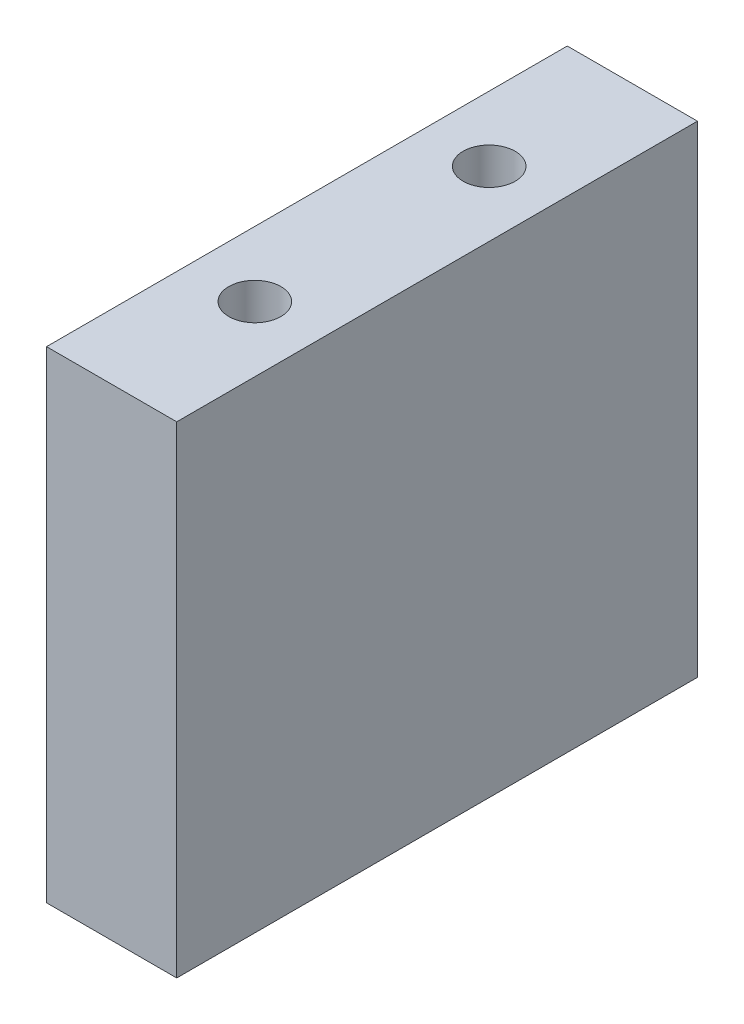
ISO-10303-21;
HEADER;
FILE_DESCRIPTION(('STEP AP214'),'2;1');
FILE_NAME('part.step','',(''),(''),'','','');
FILE_SCHEMA(('AUTOMOTIVE_DESIGN { 1 0 10303 214 1 1 1 1 }'));
ENDSEC;
DATA;
#1=APPLICATION_CONTEXT('core data for automotive mechanical design processes');
#2=APPLICATION_PROTOCOL_DEFINITION('international standard','automotive_design',2000,#1);
#3=PRODUCT_CONTEXT('',#1,'mechanical');
#4=PRODUCT('Part','Part','',(#3));
#5=PRODUCT_RELATED_PRODUCT_CATEGORY('part','',(#4));
#6=PRODUCT_DEFINITION_FORMATION('','',#4);
#7=PRODUCT_DEFINITION_CONTEXT('part definition',#1,'design');
#8=PRODUCT_DEFINITION('design','',#6,#7);
#9=PRODUCT_DEFINITION_SHAPE('','',#8);
#10=(LENGTH_UNIT() NAMED_UNIT(*) SI_UNIT(.MILLI.,.METRE.));
#11=(NAMED_UNIT(*) PLANE_ANGLE_UNIT() SI_UNIT($,.RADIAN.));
#12=(NAMED_UNIT(*) SI_UNIT($,.STERADIAN.) SOLID_ANGLE_UNIT());
#13=UNCERTAINTY_MEASURE_WITH_UNIT(LENGTH_MEASURE(1.E-05),#10,'distance_accuracy_value','');
#14=(GEOMETRIC_REPRESENTATION_CONTEXT(3) GLOBAL_UNCERTAINTY_ASSIGNED_CONTEXT((#13)) GLOBAL_UNIT_ASSIGNED_CONTEXT((#10,
#11,#12)) REPRESENTATION_CONTEXT('',''));
#15=CARTESIAN_POINT('',(0.,0.,0.));
#16=DIRECTION('',(0.,0.,1.));
#17=DIRECTION('',(1.,0.,0.));
#18=AXIS2_PLACEMENT_3D('',#15,#16,#17);
#19=CARTESIAN_POINT('',(-20.,37.,-40.));
#20=DIRECTION('',(0.,0.,-1.));
#21=DIRECTION('',(0.,1.,0.));
#22=AXIS2_PLACEMENT_3D('',#19,#20,#21);
#23=PLANE('',#22);
#24=DIRECTION('',(0.,1.,0.));
#25=VECTOR('',#24,1.);
#26=CARTESIAN_POINT('',(0.,37.,-40.));
#27=LINE('',#26,#25);
#28=CARTESIAN_POINT('',(0.,-37.,-40.));
#29=VERTEX_POINT('',#28);
#30=CARTESIAN_POINT('',(0.,37.,-40.));
#31=VERTEX_POINT('',#30);
#32=EDGE_CURVE('E98',#29,#31,#27,.T.);
#33=ORIENTED_EDGE('',*,*,#32,.F.);
#34=DIRECTION('',(1.,0.,0.));
#35=VECTOR('',#34,1.);
#36=CARTESIAN_POINT('',(-20.,-37.,-40.));
#37=LINE('',#36,#35);
#38=CARTESIAN_POINT('',(-20.,-37.,-40.));
#39=VERTEX_POINT('',#38);
#40=EDGE_CURVE('E11',#39,#29,#37,.T.);
#41=ORIENTED_EDGE('',*,*,#40,.F.);
#42=DIRECTION('',(0.,1.,0.));
#43=VECTOR('',#42,1.);
#44=CARTESIAN_POINT('',(-20.,37.,-40.));
#45=LINE('',#44,#43);
#46=CARTESIAN_POINT('',(-20.,37.,-40.));
#47=VERTEX_POINT('',#46);
#48=EDGE_CURVE('E91',#39,#47,#45,.T.);
#49=ORIENTED_EDGE('',*,*,#48,.T.);
#50=DIRECTION('',(1.,0.,0.));
#51=VECTOR('',#50,1.);
#52=CARTESIAN_POINT('',(-20.,37.,-40.));
#53=LINE('',#52,#51);
#54=EDGE_CURVE('E36',#47,#31,#53,.T.);
#55=ORIENTED_EDGE('',*,*,#54,.T.);
#56=EDGE_LOOP('',(#33,#41,#49,#55));
#57=FACE_BOUND('',#56,.T.);
#58=ADVANCED_FACE('F33',(#57),#23,.T.);
#59=CARTESIAN_POINT('',(-20.,-37.,40.));
#60=DIRECTION('',(0.,-1.,0.));
#61=DIRECTION('',(0.,0.,-1.));
#62=AXIS2_PLACEMENT_3D('',#59,#60,#61);
#63=PLANE('',#62);
#64=CARTESIAN_POINT('',(-10.,-37.,-30.));
#65=DIRECTION('',(0.,-1.,0.));
#66=DIRECTION('',(0.,0.,-1.));
#67=AXIS2_PLACEMENT_3D('',#64,#65,#66);
#68=CIRCLE('',#67,4.);
#69=CARTESIAN_POINT('',(-10.,-37.,-34.));
#70=VERTEX_POINT('',#69);
#71=EDGE_CURVE('E149',#70,#70,#68,.T.);
#72=ORIENTED_EDGE('',*,*,#71,.F.);
#73=EDGE_LOOP('',(#72));
#74=FACE_BOUND('',#73,.T.);
#75=CARTESIAN_POINT('',(-10.,-37.,30.));
#76=DIRECTION('',(0.,-1.,0.));
#77=DIRECTION('',(0.,0.,-1.));
#78=AXIS2_PLACEMENT_3D('',#75,#76,#77);
#79=CIRCLE('',#78,4.);
#80=CARTESIAN_POINT('',(-10.,-37.,26.));
#81=VERTEX_POINT('',#80);
#82=EDGE_CURVE('E143',#81,#81,#79,.T.);
#83=ORIENTED_EDGE('',*,*,#82,.F.);
#84=EDGE_LOOP('',(#83));
#85=FACE_BOUND('',#84,.T.);
#86=DIRECTION('',(0.,0.,-1.));
#87=VECTOR('',#86,1.);
#88=CARTESIAN_POINT('',(0.,-37.,40.));
#89=LINE('',#88,#87);
#90=CARTESIAN_POINT('',(0.,-37.,40.));
#91=VERTEX_POINT('',#90);
#92=EDGE_CURVE('E93',#91,#29,#89,.T.);
#93=ORIENTED_EDGE('',*,*,#92,.F.);
#94=DIRECTION('',(1.,0.,0.));
#95=VECTOR('',#94,1.);
#96=CARTESIAN_POINT('',(-20.,-37.,40.));
#97=LINE('',#96,#95);
#98=CARTESIAN_POINT('',(-20.,-37.,40.));
#99=VERTEX_POINT('',#98);
#100=EDGE_CURVE('E42',#99,#91,#97,.T.);
#101=ORIENTED_EDGE('',*,*,#100,.F.);
#102=DIRECTION('',(0.,0.,-1.));
#103=VECTOR('',#102,1.);
#104=CARTESIAN_POINT('',(-20.,-37.,40.));
#105=LINE('',#104,#103);
#106=EDGE_CURVE('E88',#99,#39,#105,.T.);
#107=ORIENTED_EDGE('',*,*,#106,.T.);
#108=ORIENTED_EDGE('',*,*,#40,.T.);
#109=EDGE_LOOP('',(#93,#101,#107,#108));
#110=FACE_BOUND('',#109,.T.);
#111=ADVANCED_FACE('F109',(#74,#85,#110),#63,.T.);
#112=CARTESIAN_POINT('',(-20.,37.,40.));
#113=DIRECTION('',(0.,0.,1.));
#114=DIRECTION('',(0.,-1.,0.));
#115=AXIS2_PLACEMENT_3D('',#112,#113,#114);
#116=PLANE('',#115);
#117=DIRECTION('',(0.,-1.,0.));
#118=VECTOR('',#117,1.);
#119=CARTESIAN_POINT('',(0.,37.,40.));
#120=LINE('',#119,#118);
#121=CARTESIAN_POINT('',(0.,37.,40.));
#122=VERTEX_POINT('',#121);
#123=EDGE_CURVE('E83',#122,#91,#120,.T.);
#124=ORIENTED_EDGE('',*,*,#123,.F.);
#125=DIRECTION('',(1.,0.,0.));
#126=VECTOR('',#125,1.);
#127=CARTESIAN_POINT('',(-20.,37.,40.));
#128=LINE('',#127,#126);
#129=CARTESIAN_POINT('',(-20.,37.,40.));
#130=VERTEX_POINT('',#129);
#131=EDGE_CURVE('E78',#130,#122,#128,.T.);
#132=ORIENTED_EDGE('',*,*,#131,.F.);
#133=DIRECTION('',(0.,-1.,0.));
#134=VECTOR('',#133,1.);
#135=CARTESIAN_POINT('',(-20.,37.,40.));
#136=LINE('',#135,#134);
#137=EDGE_CURVE('E81',#130,#99,#136,.T.);
#138=ORIENTED_EDGE('',*,*,#137,.T.);
#139=ORIENTED_EDGE('',*,*,#100,.T.);
#140=EDGE_LOOP('',(#124,#132,#138,#139));
#141=FACE_BOUND('',#140,.T.);
#142=ADVANCED_FACE('F80',(#141),#116,.T.);
#143=CARTESIAN_POINT('',(-20.,37.,40.));
#144=DIRECTION('',(0.,1.,0.));
#145=DIRECTION('',(0.,0.,1.));
#146=AXIS2_PLACEMENT_3D('',#143,#144,#145);
#147=PLANE('',#146);
#148=CARTESIAN_POINT('',(-10.,37.,-18.));
#149=DIRECTION('',(0.,1.,0.));
#150=DIRECTION('',(0.,0.,1.));
#151=AXIS2_PLACEMENT_3D('',#148,#149,#150);
#152=CIRCLE('',#151,4.);
#153=CARTESIAN_POINT('',(-10.,37.,-14.));
#154=VERTEX_POINT('',#153);
#155=EDGE_CURVE('E130',#154,#154,#152,.T.);
#156=ORIENTED_EDGE('',*,*,#155,.F.);
#157=EDGE_LOOP('',(#156));
#158=FACE_BOUND('',#157,.T.);
#159=CARTESIAN_POINT('',(-10.,37.,18.));
#160=DIRECTION('',(0.,1.,0.));
#161=DIRECTION('',(0.,0.,1.));
#162=AXIS2_PLACEMENT_3D('',#159,#160,#161);
#163=CIRCLE('',#162,4.);
#164=CARTESIAN_POINT('',(-10.,37.,22.));
#165=VERTEX_POINT('',#164);
#166=EDGE_CURVE('E133',#165,#165,#163,.T.);
#167=ORIENTED_EDGE('',*,*,#166,.F.);
#168=EDGE_LOOP('',(#167));
#169=FACE_BOUND('',#168,.T.);
#170=DIRECTION('',(0.,0.,1.));
#171=VECTOR('',#170,1.);
#172=CARTESIAN_POINT('',(0.,37.,40.));
#173=LINE('',#172,#171);
#174=EDGE_CURVE('E101',#31,#122,#173,.T.);
#175=ORIENTED_EDGE('',*,*,#174,.F.);
#176=ORIENTED_EDGE('',*,*,#54,.F.);
#177=DIRECTION('',(0.,0.,1.));
#178=VECTOR('',#177,1.);
#179=CARTESIAN_POINT('',(-20.,37.,40.));
#180=LINE('',#179,#178);
#181=EDGE_CURVE('E87',#47,#130,#180,.T.);
#182=ORIENTED_EDGE('',*,*,#181,.T.);
#183=ORIENTED_EDGE('',*,*,#131,.T.);
#184=EDGE_LOOP('',(#175,#176,#182,#183));
#185=FACE_BOUND('',#184,.T.);
#186=ADVANCED_FACE('F90',(#158,#169,#185),#147,.T.);
#187=CARTESIAN_POINT('',(-20.,0.,0.));
#188=DIRECTION('',(1.,0.,0.));
#189=DIRECTION('',(0.,0.,-1.));
#190=AXIS2_PLACEMENT_3D('',#187,#188,#189);
#191=PLANE('',#190);
#192=ORIENTED_EDGE('',*,*,#48,.F.);
#193=ORIENTED_EDGE('',*,*,#106,.F.);
#194=ORIENTED_EDGE('',*,*,#137,.F.);
#195=ORIENTED_EDGE('',*,*,#181,.F.);
#196=EDGE_LOOP('',(#192,#193,#194,#195));
#197=FACE_BOUND('',#196,.T.);
#198=ADVANCED_FACE('F86',(#197),#191,.F.);
#199=CARTESIAN_POINT('',(0.,0.,0.));
#200=DIRECTION('',(1.,0.,0.));
#201=DIRECTION('',(0.,0.,-1.));
#202=AXIS2_PLACEMENT_3D('',#199,#200,#201);
#203=PLANE('',#202);
#204=ORIENTED_EDGE('',*,*,#32,.T.);
#205=ORIENTED_EDGE('',*,*,#174,.T.);
#206=ORIENTED_EDGE('',*,*,#123,.T.);
#207=ORIENTED_EDGE('',*,*,#92,.T.);
#208=EDGE_LOOP('',(#204,#205,#206,#207));
#209=FACE_BOUND('',#208,.T.);
#210=ADVANCED_FACE('F108',(#209),#203,.T.);
#211=CARTESIAN_POINT('',(-10.,12.,18.));
#212=DIRECTION('',(0.,1.,0.));
#213=DIRECTION('',(0.,0.,1.));
#214=AXIS2_PLACEMENT_3D('',#211,#212,#213);
#215=CYLINDRICAL_SURFACE('',#214,4.);
#216=CARTESIAN_POINT('',(-10.,12.,18.));
#217=DIRECTION('',(0.,1.,0.));
#218=DIRECTION('',(0.,0.,1.));
#219=AXIS2_PLACEMENT_3D('',#216,#217,#218);
#220=CIRCLE('',#219,4.);
#221=CARTESIAN_POINT('',(-10.,12.,22.));
#222=VERTEX_POINT('',#221);
#223=EDGE_CURVE('E102',#222,#222,#220,.T.);
#224=ORIENTED_EDGE('',*,*,#223,.F.);
#225=EDGE_LOOP('',(#224));
#226=FACE_BOUND('',#225,.T.);
#227=ORIENTED_EDGE('',*,*,#166,.T.);
#228=EDGE_LOOP('',(#227));
#229=FACE_BOUND('',#228,.T.);
#230=ADVANCED_FACE('F185',(#226,#229),#215,.F.);
#231=CARTESIAN_POINT('',(-10.,12.,18.));
#232=DIRECTION('',(0.,1.,0.));
#233=DIRECTION('',(0.,0.,1.));
#234=AXIS2_PLACEMENT_3D('',#231,#232,#233);
#235=PLANE('',#234);
#236=ORIENTED_EDGE('',*,*,#223,.T.);
#237=EDGE_LOOP('',(#236));
#238=FACE_BOUND('',#237,.T.);
#239=ADVANCED_FACE('F181',(#238),#235,.T.);
#240=CARTESIAN_POINT('',(-10.,12.,-18.));
#241=DIRECTION('',(0.,1.,0.));
#242=DIRECTION('',(0.,0.,1.));
#243=AXIS2_PLACEMENT_3D('',#240,#241,#242);
#244=CYLINDRICAL_SURFACE('',#243,4.);
#245=CARTESIAN_POINT('',(-10.,12.,-18.));
#246=DIRECTION('',(0.,1.,0.));
#247=DIRECTION('',(0.,0.,1.));
#248=AXIS2_PLACEMENT_3D('',#245,#246,#247);
#249=CIRCLE('',#248,4.);
#250=CARTESIAN_POINT('',(-10.,12.,-14.));
#251=VERTEX_POINT('',#250);
#252=EDGE_CURVE('E135',#251,#251,#249,.T.);
#253=ORIENTED_EDGE('',*,*,#252,.F.);
#254=EDGE_LOOP('',(#253));
#255=FACE_BOUND('',#254,.T.);
#256=ORIENTED_EDGE('',*,*,#155,.T.);
#257=EDGE_LOOP('',(#256));
#258=FACE_BOUND('',#257,.T.);
#259=ADVANCED_FACE('F177',(#255,#258),#244,.F.);
#260=CARTESIAN_POINT('',(-10.,12.,-18.));
#261=DIRECTION('',(0.,1.,0.));
#262=DIRECTION('',(0.,0.,1.));
#263=AXIS2_PLACEMENT_3D('',#260,#261,#262);
#264=PLANE('',#263);
#265=ORIENTED_EDGE('',*,*,#252,.T.);
#266=EDGE_LOOP('',(#265));
#267=FACE_BOUND('',#266,.T.);
#268=ADVANCED_FACE('F173',(#267),#264,.T.);
#269=CARTESIAN_POINT('',(-10.,-7.,30.));
#270=DIRECTION('',(0.,-1.,0.));
#271=DIRECTION('',(0.,0.,-1.));
#272=AXIS2_PLACEMENT_3D('',#269,#270,#271);
#273=CYLINDRICAL_SURFACE('',#272,4.);
#274=CARTESIAN_POINT('',(-10.,-7.,30.));
#275=DIRECTION('',(0.,-1.,0.));
#276=DIRECTION('',(0.,0.,-1.));
#277=AXIS2_PLACEMENT_3D('',#274,#275,#276);
#278=CIRCLE('',#277,4.);
#279=CARTESIAN_POINT('',(-10.,-7.,26.));
#280=VERTEX_POINT('',#279);
#281=EDGE_CURVE('E141',#280,#280,#278,.T.);
#282=ORIENTED_EDGE('',*,*,#281,.F.);
#283=EDGE_LOOP('',(#282));
#284=FACE_BOUND('',#283,.T.);
#285=ORIENTED_EDGE('',*,*,#82,.T.);
#286=EDGE_LOOP('',(#285));
#287=FACE_BOUND('',#286,.T.);
#288=ADVANCED_FACE('F167',(#284,#287),#273,.F.);
#289=CARTESIAN_POINT('',(-10.,-7.,30.));
#290=DIRECTION('',(0.,-1.,0.));
#291=DIRECTION('',(0.,0.,-1.));
#292=AXIS2_PLACEMENT_3D('',#289,#290,#291);
#293=PLANE('',#292);
#294=ORIENTED_EDGE('',*,*,#281,.T.);
#295=EDGE_LOOP('',(#294));
#296=FACE_BOUND('',#295,.T.);
#297=ADVANCED_FACE('F160',(#296),#293,.T.);
#298=CARTESIAN_POINT('',(-10.,-7.,-30.));
#299=DIRECTION('',(0.,-1.,0.));
#300=DIRECTION('',(0.,0.,-1.));
#301=AXIS2_PLACEMENT_3D('',#298,#299,#300);
#302=CYLINDRICAL_SURFACE('',#301,4.);
#303=CARTESIAN_POINT('',(-10.,-7.,-30.));
#304=DIRECTION('',(0.,-1.,0.));
#305=DIRECTION('',(0.,0.,-1.));
#306=AXIS2_PLACEMENT_3D('',#303,#304,#305);
#307=CIRCLE('',#306,4.);
#308=CARTESIAN_POINT('',(-10.,-7.,-34.));
#309=VERTEX_POINT('',#308);
#310=EDGE_CURVE('E146',#309,#309,#307,.T.);
#311=ORIENTED_EDGE('',*,*,#310,.F.);
#312=EDGE_LOOP('',(#311));
#313=FACE_BOUND('',#312,.T.);
#314=ORIENTED_EDGE('',*,*,#71,.T.);
#315=EDGE_LOOP('',(#314));
#316=FACE_BOUND('',#315,.T.);
#317=ADVANCED_FACE('F157',(#313,#316),#302,.F.);
#318=CARTESIAN_POINT('',(-10.,-7.,-30.));
#319=DIRECTION('',(0.,-1.,0.));
#320=DIRECTION('',(0.,0.,-1.));
#321=AXIS2_PLACEMENT_3D('',#318,#319,#320);
#322=PLANE('',#321);
#323=ORIENTED_EDGE('',*,*,#310,.T.);
#324=EDGE_LOOP('',(#323));
#325=FACE_BOUND('',#324,.T.);
#326=ADVANCED_FACE('F155',(#325),#322,.T.);
#327=CLOSED_SHELL('',(#58,#111,#142,#186,#198,#210,#230,#239,#259,#268,#288,#297,#317,#326));
#328=MANIFOLD_SOLID_BREP('B2',#327);
#329=ADVANCED_BREP_SHAPE_REPRESENTATION('',(#18,#328),#14);
#330=SHAPE_DEFINITION_REPRESENTATION(#9,#329);
ENDSEC;
END-ISO-10303-21;
